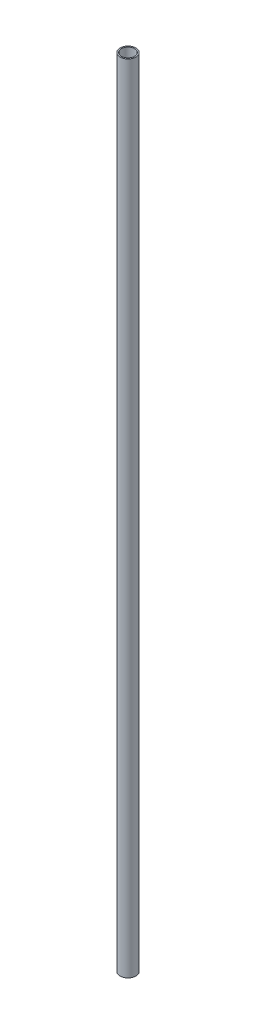
ISO-10303-21;
HEADER;
FILE_DESCRIPTION(('STEP AP214'),'2;1');
FILE_NAME('part.step','',(''),(''),'','','');
FILE_SCHEMA(('AUTOMOTIVE_DESIGN { 1 0 10303 214 1 1 1 1 }'));
ENDSEC;
DATA;
#1=APPLICATION_CONTEXT('core data for automotive mechanical design processes');
#2=APPLICATION_PROTOCOL_DEFINITION('international standard','automotive_design',2000,#1);
#3=PRODUCT_CONTEXT('',#1,'mechanical');
#4=PRODUCT('Part','Part','',(#3));
#5=PRODUCT_RELATED_PRODUCT_CATEGORY('part','',(#4));
#6=PRODUCT_DEFINITION_FORMATION('','',#4);
#7=PRODUCT_DEFINITION_CONTEXT('part definition',#1,'design');
#8=PRODUCT_DEFINITION('design','',#6,#7);
#9=PRODUCT_DEFINITION_SHAPE('','',#8);
#10=(LENGTH_UNIT() NAMED_UNIT(*) SI_UNIT(.MILLI.,.METRE.));
#11=(NAMED_UNIT(*) PLANE_ANGLE_UNIT() SI_UNIT($,.RADIAN.));
#12=(NAMED_UNIT(*) SI_UNIT($,.STERADIAN.) SOLID_ANGLE_UNIT());
#13=UNCERTAINTY_MEASURE_WITH_UNIT(LENGTH_MEASURE(1.E-05),#10,'distance_accuracy_value','');
#14=(GEOMETRIC_REPRESENTATION_CONTEXT(3) GLOBAL_UNCERTAINTY_ASSIGNED_CONTEXT((#13)) GLOBAL_UNIT_ASSIGNED_CONTEXT((#10,
#11,#12)) REPRESENTATION_CONTEXT('',''));
#15=CARTESIAN_POINT('',(0.,0.,0.));
#16=DIRECTION('',(0.,0.,1.));
#17=DIRECTION('',(1.,0.,0.));
#18=AXIS2_PLACEMENT_3D('',#15,#16,#17);
#19=CARTESIAN_POINT('',(0.,600.,0.));
#20=DIRECTION('',(0.,1.,0.));
#21=DIRECTION('',(0.,0.,1.));
#22=AXIS2_PLACEMENT_3D('',#19,#20,#21);
#23=PLANE('',#22);
#24=CARTESIAN_POINT('',(0.,600.,0.));
#25=DIRECTION('',(0.,1.,0.));
#26=DIRECTION('',(0.,0.,1.));
#27=AXIS2_PLACEMENT_3D('',#24,#25,#26);
#28=CIRCLE('',#27,6.);
#29=CARTESIAN_POINT('',(0.,600.,6.));
#30=VERTEX_POINT('',#29);
#31=EDGE_CURVE('E10',#30,#30,#28,.T.);
#32=ORIENTED_EDGE('',*,*,#31,.T.);
#33=EDGE_LOOP('',(#32));
#34=FACE_BOUND('',#33,.T.);
#35=CARTESIAN_POINT('',(0.,600.,0.));
#36=DIRECTION('',(0.,1.,0.));
#37=DIRECTION('',(0.,0.,1.));
#38=AXIS2_PLACEMENT_3D('',#35,#36,#37);
#39=CIRCLE('',#38,5.);
#40=CARTESIAN_POINT('',(0.,600.,5.));
#41=VERTEX_POINT('',#40);
#42=EDGE_CURVE('E46',#41,#41,#39,.T.);
#43=ORIENTED_EDGE('',*,*,#42,.F.);
#44=EDGE_LOOP('',(#43));
#45=FACE_BOUND('',#44,.T.);
#46=ADVANCED_FACE('F35',(#34,#45),#23,.T.);
#47=CARTESIAN_POINT('',(0.,0.,0.));
#48=DIRECTION('',(0.,1.,0.));
#49=DIRECTION('',(0.,0.,1.));
#50=AXIS2_PLACEMENT_3D('',#47,#48,#49);
#51=PLANE('',#50);
#52=CARTESIAN_POINT('',(0.,0.,0.));
#53=DIRECTION('',(0.,1.,0.));
#54=DIRECTION('',(0.,0.,1.));
#55=AXIS2_PLACEMENT_3D('',#52,#53,#54);
#56=CIRCLE('',#55,6.);
#57=CARTESIAN_POINT('',(0.,0.,6.));
#58=VERTEX_POINT('',#57);
#59=EDGE_CURVE('E39',#58,#58,#56,.T.);
#60=ORIENTED_EDGE('',*,*,#59,.F.);
#61=EDGE_LOOP('',(#60));
#62=FACE_BOUND('',#61,.T.);
#63=CARTESIAN_POINT('',(0.,0.,0.));
#64=DIRECTION('',(0.,1.,0.));
#65=DIRECTION('',(0.,0.,1.));
#66=AXIS2_PLACEMENT_3D('',#63,#64,#65);
#67=CIRCLE('',#66,5.);
#68=CARTESIAN_POINT('',(0.,0.,5.));
#69=VERTEX_POINT('',#68);
#70=EDGE_CURVE('E48',#69,#69,#67,.T.);
#71=ORIENTED_EDGE('',*,*,#70,.T.);
#72=EDGE_LOOP('',(#71));
#73=FACE_BOUND('',#72,.T.);
#74=ADVANCED_FACE('F58',(#62,#73),#51,.F.);
#75=CARTESIAN_POINT('',(0.,600.,0.));
#76=DIRECTION('',(0.,-1.,0.));
#77=DIRECTION('',(0.,0.,-1.));
#78=AXIS2_PLACEMENT_3D('',#75,#76,#77);
#79=CYLINDRICAL_SURFACE('',#78,6.);
#80=ORIENTED_EDGE('',*,*,#31,.F.);
#81=EDGE_LOOP('',(#80));
#82=FACE_BOUND('',#81,.T.);
#83=ORIENTED_EDGE('',*,*,#59,.T.);
#84=EDGE_LOOP('',(#83));
#85=FACE_BOUND('',#84,.T.);
#86=ADVANCED_FACE('F37',(#82,#85),#79,.T.);
#87=CARTESIAN_POINT('',(0.,600.,0.));
#88=DIRECTION('',(0.,-1.,0.));
#89=DIRECTION('',(0.,0.,-1.));
#90=AXIS2_PLACEMENT_3D('',#87,#88,#89);
#91=CYLINDRICAL_SURFACE('',#90,5.);
#92=ORIENTED_EDGE('',*,*,#42,.T.);
#93=EDGE_LOOP('',(#92));
#94=FACE_BOUND('',#93,.T.);
#95=ORIENTED_EDGE('',*,*,#70,.F.);
#96=EDGE_LOOP('',(#95));
#97=FACE_BOUND('',#96,.T.);
#98=ADVANCED_FACE('F54',(#94,#97),#91,.F.);
#99=CLOSED_SHELL('',(#46,#74,#86,#98));
#100=MANIFOLD_SOLID_BREP('B2',#99);
#101=ADVANCED_BREP_SHAPE_REPRESENTATION('',(#18,#100),#14);
#102=SHAPE_DEFINITION_REPRESENTATION(#9,#101);
ENDSEC;
END-ISO-10303-21;
